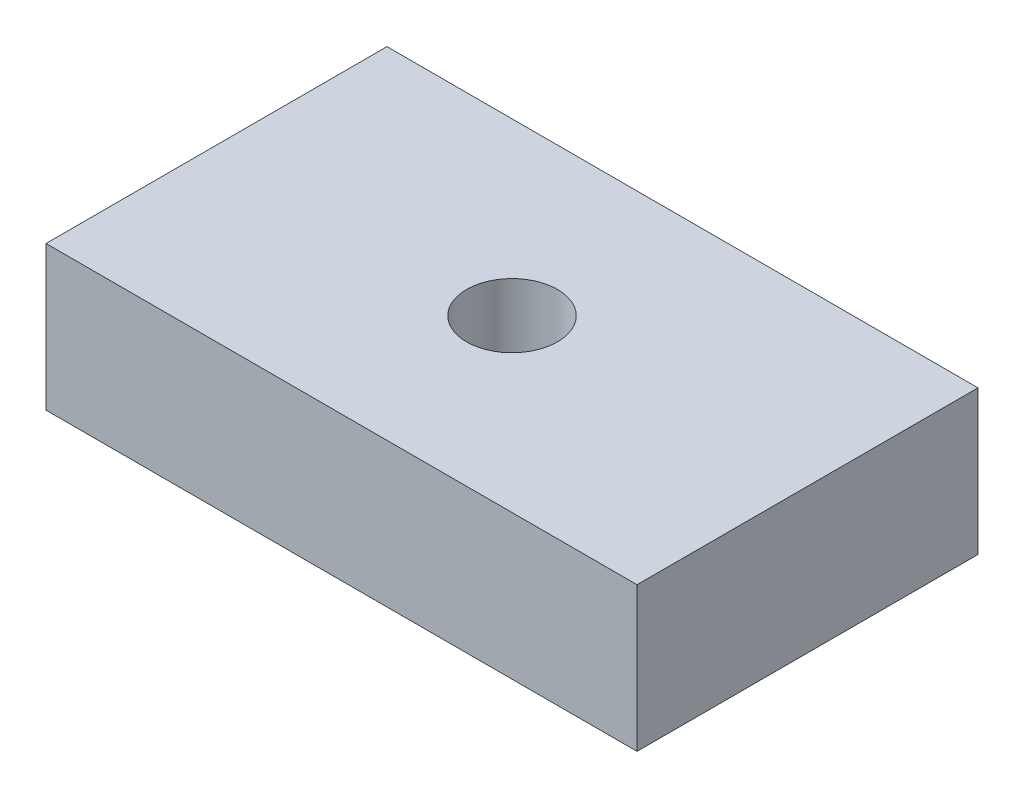
ISO-10303-21;
HEADER;
FILE_DESCRIPTION(('STEP AP214'),'2;1');
FILE_NAME('part.step','',(''),(''),'','','');
FILE_SCHEMA(('AUTOMOTIVE_DESIGN { 1 0 10303 214 1 1 1 1 }'));
ENDSEC;
DATA;
#1=APPLICATION_CONTEXT('core data for automotive mechanical design processes');
#2=APPLICATION_PROTOCOL_DEFINITION('international standard','automotive_design',2000,#1);
#3=PRODUCT_CONTEXT('',#1,'mechanical');
#4=PRODUCT('Part','Part','',(#3));
#5=PRODUCT_RELATED_PRODUCT_CATEGORY('part','',(#4));
#6=PRODUCT_DEFINITION_FORMATION('','',#4);
#7=PRODUCT_DEFINITION_CONTEXT('part definition',#1,'design');
#8=PRODUCT_DEFINITION('design','',#6,#7);
#9=PRODUCT_DEFINITION_SHAPE('','',#8);
#10=(LENGTH_UNIT() NAMED_UNIT(*) SI_UNIT(.MILLI.,.METRE.));
#11=(NAMED_UNIT(*) PLANE_ANGLE_UNIT() SI_UNIT($,.RADIAN.));
#12=(NAMED_UNIT(*) SI_UNIT($,.STERADIAN.) SOLID_ANGLE_UNIT());
#13=UNCERTAINTY_MEASURE_WITH_UNIT(LENGTH_MEASURE(1.E-05),#10,'distance_accuracy_value','');
#14=(GEOMETRIC_REPRESENTATION_CONTEXT(3) GLOBAL_UNCERTAINTY_ASSIGNED_CONTEXT((#13)) GLOBAL_UNIT_ASSIGNED_CONTEXT((#10,
#11,#12)) REPRESENTATION_CONTEXT('',''));
#15=CARTESIAN_POINT('',(0.,0.,0.));
#16=DIRECTION('',(0.,0.,1.));
#17=DIRECTION('',(1.,0.,0.));
#18=AXIS2_PLACEMENT_3D('',#15,#16,#17);
#19=CARTESIAN_POINT('',(-26.,6.35,-7.5));
#20=DIRECTION('',(0.,0.,1.));
#21=DIRECTION('',(1.,0.,0.));
#22=AXIS2_PLACEMENT_3D('',#19,#20,#21);
#23=PLANE('',#22);
#24=DIRECTION('',(-1.,0.,0.));
#25=VECTOR('',#24,1.);
#26=CARTESIAN_POINT('',(-26.,6.35,-7.5));
#27=LINE('',#26,#25);
#28=CARTESIAN_POINT('',(0.,6.35,-7.5));
#29=VERTEX_POINT('',#28);
#30=CARTESIAN_POINT('',(-26.,6.35,-7.5));
#31=VERTEX_POINT('',#30);
#32=EDGE_CURVE('E94',#29,#31,#27,.T.);
#33=ORIENTED_EDGE('',*,*,#32,.F.);
#34=DIRECTION('',(0.,1.,0.));
#35=VECTOR('',#34,1.);
#36=CARTESIAN_POINT('',(0.,0.,-7.5));
#37=LINE('',#36,#35);
#38=CARTESIAN_POINT('',(0.,0.,-7.5));
#39=VERTEX_POINT('',#38);
#40=EDGE_CURVE('E107',#39,#29,#37,.T.);
#41=ORIENTED_EDGE('',*,*,#40,.F.);
#42=DIRECTION('',(-1.,0.,0.));
#43=VECTOR('',#42,1.);
#44=CARTESIAN_POINT('',(-26.,0.,-7.5));
#45=LINE('',#44,#43);
#46=CARTESIAN_POINT('',(-26.,0.,-7.5));
#47=VERTEX_POINT('',#46);
#48=EDGE_CURVE('E85',#39,#47,#45,.T.);
#49=ORIENTED_EDGE('',*,*,#48,.T.);
#50=DIRECTION('',(0.,-1.,0.));
#51=VECTOR('',#50,1.);
#52=CARTESIAN_POINT('',(-26.,6.35,-7.5));
#53=LINE('',#52,#51);
#54=EDGE_CURVE('E11',#31,#47,#53,.T.);
#55=ORIENTED_EDGE('',*,*,#54,.F.);
#56=EDGE_LOOP('',(#33,#41,#49,#55));
#57=FACE_BOUND('',#56,.T.);
#58=ADVANCED_FACE('F41',(#57),#23,.F.);
#59=CARTESIAN_POINT('',(-26.,6.35,7.5));
#60=DIRECTION('',(1.,0.,0.));
#61=DIRECTION('',(0.,0.,-1.));
#62=AXIS2_PLACEMENT_3D('',#59,#60,#61);
#63=PLANE('',#62);
#64=DIRECTION('',(0.,0.,1.));
#65=VECTOR('',#64,1.);
#66=CARTESIAN_POINT('',(-26.,0.,7.5));
#67=LINE('',#66,#65);
#68=CARTESIAN_POINT('',(-26.,0.,7.5));
#69=VERTEX_POINT('',#68);
#70=EDGE_CURVE('E76',#47,#69,#67,.T.);
#71=ORIENTED_EDGE('',*,*,#70,.T.);
#72=DIRECTION('',(0.,-1.,0.));
#73=VECTOR('',#72,1.);
#74=CARTESIAN_POINT('',(-26.,6.35,7.5));
#75=LINE('',#74,#73);
#76=CARTESIAN_POINT('',(-26.,6.35,7.5));
#77=VERTEX_POINT('',#76);
#78=EDGE_CURVE('E48',#77,#69,#75,.T.);
#79=ORIENTED_EDGE('',*,*,#78,.F.);
#80=DIRECTION('',(0.,0.,1.));
#81=VECTOR('',#80,1.);
#82=CARTESIAN_POINT('',(-26.,6.35,7.5));
#83=LINE('',#82,#81);
#84=EDGE_CURVE('E64',#31,#77,#83,.T.);
#85=ORIENTED_EDGE('',*,*,#84,.F.);
#86=ORIENTED_EDGE('',*,*,#54,.T.);
#87=EDGE_LOOP('',(#71,#79,#85,#86));
#88=FACE_BOUND('',#87,.T.);
#89=ADVANCED_FACE('F78',(#88),#63,.F.);
#90=CARTESIAN_POINT('',(-26.,6.35,7.5));
#91=DIRECTION('',(0.,0.,-1.));
#92=DIRECTION('',(-1.,0.,0.));
#93=AXIS2_PLACEMENT_3D('',#90,#91,#92);
#94=PLANE('',#93);
#95=DIRECTION('',(1.,0.,0.));
#96=VECTOR('',#95,1.);
#97=CARTESIAN_POINT('',(-26.,0.,7.5));
#98=LINE('',#97,#96);
#99=CARTESIAN_POINT('',(0.,0.,7.5));
#100=VERTEX_POINT('',#99);
#101=EDGE_CURVE('E84',#69,#100,#98,.T.);
#102=ORIENTED_EDGE('',*,*,#101,.T.);
#103=DIRECTION('',(0.,1.,0.));
#104=VECTOR('',#103,1.);
#105=CARTESIAN_POINT('',(0.,0.,7.5));
#106=LINE('',#105,#104);
#107=CARTESIAN_POINT('',(0.,6.35,7.5));
#108=VERTEX_POINT('',#107);
#109=EDGE_CURVE('E55',#100,#108,#106,.T.);
#110=ORIENTED_EDGE('',*,*,#109,.T.);
#111=DIRECTION('',(1.,0.,0.));
#112=VECTOR('',#111,1.);
#113=CARTESIAN_POINT('',(-26.,6.35,7.5));
#114=LINE('',#113,#112);
#115=EDGE_CURVE('E90',#77,#108,#114,.T.);
#116=ORIENTED_EDGE('',*,*,#115,.F.);
#117=ORIENTED_EDGE('',*,*,#78,.T.);
#118=EDGE_LOOP('',(#102,#110,#116,#117));
#119=FACE_BOUND('',#118,.T.);
#120=ADVANCED_FACE('F89',(#119),#94,.F.);
#121=CARTESIAN_POINT('',(0.,6.35,0.));
#122=DIRECTION('',(0.,-1.,0.));
#123=DIRECTION('',(0.,0.,-1.));
#124=AXIS2_PLACEMENT_3D('',#121,#122,#123);
#125=PLANE('',#124);
#126=CARTESIAN_POINT('',(-13.,6.35,0.));
#127=DIRECTION('',(0.,1.,0.));
#128=DIRECTION('',(0.,0.,1.));
#129=AXIS2_PLACEMENT_3D('',#126,#127,#128);
#130=CIRCLE('',#129,2.);
#131=CARTESIAN_POINT('',(-13.,6.35,2.00000000000001));
#132=VERTEX_POINT('',#131);
#133=EDGE_CURVE('E102',#132,#132,#130,.T.);
#134=ORIENTED_EDGE('',*,*,#133,.F.);
#135=EDGE_LOOP('',(#134));
#136=FACE_BOUND('',#135,.T.);
#137=ORIENTED_EDGE('',*,*,#115,.T.);
#138=DIRECTION('',(0.,0.,1.));
#139=VECTOR('',#138,1.);
#140=CARTESIAN_POINT('',(0.,6.35,-7.5));
#141=LINE('',#140,#139);
#142=EDGE_CURVE('E111',#29,#108,#141,.T.);
#143=ORIENTED_EDGE('',*,*,#142,.F.);
#144=ORIENTED_EDGE('',*,*,#32,.T.);
#145=ORIENTED_EDGE('',*,*,#84,.T.);
#146=EDGE_LOOP('',(#137,#143,#144,#145));
#147=FACE_BOUND('',#146,.T.);
#148=ADVANCED_FACE('F119',(#136,#147),#125,.F.);
#149=CARTESIAN_POINT('',(0.,0.,0.));
#150=DIRECTION('',(0.,-1.,0.));
#151=DIRECTION('',(0.,0.,-1.));
#152=AXIS2_PLACEMENT_3D('',#149,#150,#151);
#153=PLANE('',#152);
#154=DIRECTION('',(0.,0.,1.));
#155=VECTOR('',#154,1.);
#156=CARTESIAN_POINT('',(0.,0.,-7.5));
#157=LINE('',#156,#155);
#158=EDGE_CURVE('E93',#39,#100,#157,.T.);
#159=ORIENTED_EDGE('',*,*,#158,.T.);
#160=ORIENTED_EDGE('',*,*,#101,.F.);
#161=ORIENTED_EDGE('',*,*,#70,.F.);
#162=ORIENTED_EDGE('',*,*,#48,.F.);
#163=EDGE_LOOP('',(#159,#160,#161,#162));
#164=FACE_BOUND('',#163,.T.);
#165=CARTESIAN_POINT('',(-13.,0.,0.));
#166=DIRECTION('',(0.,1.,0.));
#167=DIRECTION('',(0.,0.,1.));
#168=AXIS2_PLACEMENT_3D('',#165,#166,#167);
#169=CIRCLE('',#168,2.);
#170=CARTESIAN_POINT('',(-13.,0.,2.00000000000001));
#171=VERTEX_POINT('',#170);
#172=EDGE_CURVE('E99',#171,#171,#169,.T.);
#173=ORIENTED_EDGE('',*,*,#172,.T.);
#174=EDGE_LOOP('',(#173));
#175=FACE_BOUND('',#174,.T.);
#176=ADVANCED_FACE('F91',(#164,#175),#153,.T.);
#177=CARTESIAN_POINT('',(-13.,0.,0.));
#178=DIRECTION('',(0.,1.,0.));
#179=DIRECTION('',(0.,0.,1.));
#180=AXIS2_PLACEMENT_3D('',#177,#178,#179);
#181=CYLINDRICAL_SURFACE('',#180,2.);
#182=ORIENTED_EDGE('',*,*,#172,.F.);
#183=EDGE_LOOP('',(#182));
#184=FACE_BOUND('',#183,.T.);
#185=ORIENTED_EDGE('',*,*,#133,.T.);
#186=EDGE_LOOP('',(#185));
#187=FACE_BOUND('',#186,.T.);
#188=ADVANCED_FACE('F127',(#184,#187),#181,.F.);
#189=CARTESIAN_POINT('',(0.,0.,-7.5));
#190=DIRECTION('',(-1.,0.,0.));
#191=DIRECTION('',(0.,0.,1.));
#192=AXIS2_PLACEMENT_3D('',#189,#190,#191);
#193=PLANE('',#192);
#194=ORIENTED_EDGE('',*,*,#142,.T.);
#195=ORIENTED_EDGE('',*,*,#109,.F.);
#196=ORIENTED_EDGE('',*,*,#158,.F.);
#197=ORIENTED_EDGE('',*,*,#40,.T.);
#198=EDGE_LOOP('',(#194,#195,#196,#197));
#199=FACE_BOUND('',#198,.T.);
#200=ADVANCED_FACE('F115',(#199),#193,.F.);
#201=CLOSED_SHELL('',(#58,#89,#120,#148,#176,#188,#200));
#202=MANIFOLD_SOLID_BREP('B2',#201);
#203=ADVANCED_BREP_SHAPE_REPRESENTATION('',(#18,#202),#14);
#204=SHAPE_DEFINITION_REPRESENTATION(#9,#203);
ENDSEC;
END-ISO-10303-21;
